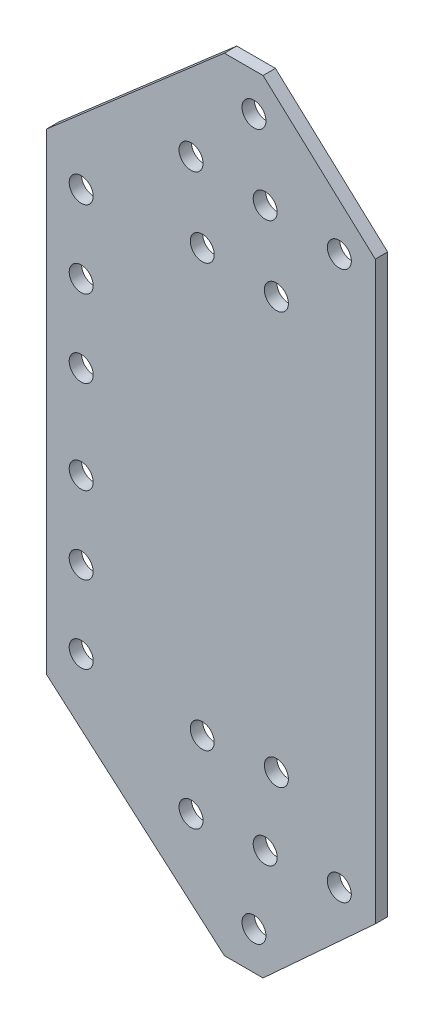
ISO-10303-21;
HEADER;
FILE_DESCRIPTION(('STEP AP214'),'2;1');
FILE_NAME('part.step','',(''),(''),'','','');
FILE_SCHEMA(('AUTOMOTIVE_DESIGN { 1 0 10303 214 1 1 1 1 }'));
ENDSEC;
DATA;
#1=APPLICATION_CONTEXT('core data for automotive mechanical design processes');
#2=APPLICATION_PROTOCOL_DEFINITION('international standard','automotive_design',2000,#1);
#3=PRODUCT_CONTEXT('',#1,'mechanical');
#4=PRODUCT('Part','Part','',(#3));
#5=PRODUCT_RELATED_PRODUCT_CATEGORY('part','',(#4));
#6=PRODUCT_DEFINITION_FORMATION('','',#4);
#7=PRODUCT_DEFINITION_CONTEXT('part definition',#1,'design');
#8=PRODUCT_DEFINITION('design','',#6,#7);
#9=PRODUCT_DEFINITION_SHAPE('','',#8);
#10=(LENGTH_UNIT() NAMED_UNIT(*) SI_UNIT(.MILLI.,.METRE.));
#11=(NAMED_UNIT(*) PLANE_ANGLE_UNIT() SI_UNIT($,.RADIAN.));
#12=(NAMED_UNIT(*) SI_UNIT($,.STERADIAN.) SOLID_ANGLE_UNIT());
#13=UNCERTAINTY_MEASURE_WITH_UNIT(LENGTH_MEASURE(1.E-05),#10,'distance_accuracy_value','');
#14=(GEOMETRIC_REPRESENTATION_CONTEXT(3) GLOBAL_UNCERTAINTY_ASSIGNED_CONTEXT((#13)) GLOBAL_UNIT_ASSIGNED_CONTEXT((#10,
#11,#12)) REPRESENTATION_CONTEXT('',''));
#15=CARTESIAN_POINT('',(0.,0.,0.));
#16=DIRECTION('',(0.,0.,1.));
#17=DIRECTION('',(1.,0.,0.));
#18=AXIS2_PLACEMENT_3D('',#15,#16,#17);
#19=CARTESIAN_POINT('',(-395.537960368614,-296.432159704098,16.));
#20=DIRECTION('',(0.656178714924787,0.754605522163505,0.));
#21=DIRECTION('',(-0.754605522163505,0.656178714924787,0.));
#22=AXIS2_PLACEMENT_3D('',#19,#20,#21);
#23=PLANE('',#22);
#24=DIRECTION('',(0.754605522163505,-0.656178714924787,0.));
#25=VECTOR('',#24,1.);
#26=CARTESIAN_POINT('',(-395.537960368614,-296.432159704098,0.));
#27=LINE('',#26,#25);
#28=CARTESIAN_POINT('',(-395.537960368614,-296.432159704098,0.));
#29=VERTEX_POINT('',#28);
#30=CARTESIAN_POINT('',(-165.537960368614,-496.432159704098,0.));
#31=VERTEX_POINT('',#30);
#32=EDGE_CURVE('E128',#29,#31,#27,.T.);
#33=ORIENTED_EDGE('',*,*,#32,.T.);
#34=DIRECTION('',(0.,0.,-1.));
#35=VECTOR('',#34,1.);
#36=CARTESIAN_POINT('',(-165.537960368614,-496.432159704098,16.));
#37=LINE('',#36,#35);
#38=CARTESIAN_POINT('',(-165.537960368614,-496.432159704098,16.));
#39=VERTEX_POINT('',#38);
#40=EDGE_CURVE('E11',#39,#31,#37,.T.);
#41=ORIENTED_EDGE('',*,*,#40,.F.);
#42=DIRECTION('',(0.754605522163505,-0.656178714924787,0.));
#43=VECTOR('',#42,1.);
#44=CARTESIAN_POINT('',(-395.537960368614,-296.432159704098,16.));
#45=LINE('',#44,#43);
#46=CARTESIAN_POINT('',(-395.537960368614,-296.432159704098,16.));
#47=VERTEX_POINT('',#46);
#48=EDGE_CURVE('E143',#47,#39,#45,.T.);
#49=ORIENTED_EDGE('',*,*,#48,.F.);
#50=DIRECTION('',(0.,0.,-1.));
#51=VECTOR('',#50,1.);
#52=CARTESIAN_POINT('',(-395.537960368614,-296.432159704098,16.));
#53=LINE('',#52,#51);
#54=EDGE_CURVE('E124',#47,#29,#53,.T.);
#55=ORIENTED_EDGE('',*,*,#54,.T.);
#56=EDGE_LOOP('',(#33,#41,#49,#55));
#57=FACE_BOUND('',#56,.T.);
#58=ADVANCED_FACE('F32',(#57),#23,.F.);
#59=CARTESIAN_POINT('',(-165.537960368614,-496.432159704098,16.));
#60=DIRECTION('',(0.,1.,0.));
#61=DIRECTION('',(0.,0.,1.));
#62=AXIS2_PLACEMENT_3D('',#59,#60,#61);
#63=PLANE('',#62);
#64=DIRECTION('',(1.,0.,0.));
#65=VECTOR('',#64,1.);
#66=CARTESIAN_POINT('',(-165.537960368614,-496.432159704098,0.));
#67=LINE('',#66,#65);
#68=CARTESIAN_POINT('',(-115.537960368614,-496.432159704098,0.));
#69=VERTEX_POINT('',#68);
#70=EDGE_CURVE('E131',#31,#69,#67,.T.);
#71=ORIENTED_EDGE('',*,*,#70,.T.);
#72=DIRECTION('',(0.,0.,-1.));
#73=VECTOR('',#72,1.);
#74=CARTESIAN_POINT('',(-115.537960368614,-496.432159704098,16.));
#75=LINE('',#74,#73);
#76=CARTESIAN_POINT('',(-115.537960368614,-496.432159704098,16.));
#77=VERTEX_POINT('',#76);
#78=EDGE_CURVE('E40',#77,#69,#75,.T.);
#79=ORIENTED_EDGE('',*,*,#78,.F.);
#80=DIRECTION('',(1.,0.,0.));
#81=VECTOR('',#80,1.);
#82=CARTESIAN_POINT('',(-165.537960368614,-496.432159704098,16.));
#83=LINE('',#82,#81);
#84=EDGE_CURVE('E91',#39,#77,#83,.T.);
#85=ORIENTED_EDGE('',*,*,#84,.F.);
#86=ORIENTED_EDGE('',*,*,#40,.T.);
#87=EDGE_LOOP('',(#71,#79,#85,#86));
#88=FACE_BOUND('',#87,.T.);
#89=ADVANCED_FACE('F346',(#88),#63,.F.);
#90=CARTESIAN_POINT('',(-115.537960368614,-496.432159704098,16.));
#91=DIRECTION('',(-0.675954740481505,0.736943138118934,0.));
#92=DIRECTION('',(-0.736943138118934,-0.675954740481505,0.));
#93=AXIS2_PLACEMENT_3D('',#90,#91,#92);
#94=PLANE('',#93);
#95=DIRECTION('',(0.736943138118933,0.675954740481505,0.));
#96=VECTOR('',#95,1.);
#97=CARTESIAN_POINT('',(-115.537960368614,-496.432159704098,0.));
#98=LINE('',#97,#96);
#99=CARTESIAN_POINT('',(29.462039631386,-363.432159704098,0.));
#100=VERTEX_POINT('',#99);
#101=EDGE_CURVE('E134',#69,#100,#98,.T.);
#102=ORIENTED_EDGE('',*,*,#101,.T.);
#103=DIRECTION('',(0.,0.,-1.));
#104=VECTOR('',#103,1.);
#105=CARTESIAN_POINT('',(29.462039631386,-363.432159704098,16.));
#106=LINE('',#105,#104);
#107=CARTESIAN_POINT('',(29.462039631386,-363.432159704098,16.));
#108=VERTEX_POINT('',#107);
#109=EDGE_CURVE('E150',#108,#100,#106,.T.);
#110=ORIENTED_EDGE('',*,*,#109,.F.);
#111=DIRECTION('',(0.736943138118933,0.675954740481505,0.));
#112=VECTOR('',#111,1.);
#113=CARTESIAN_POINT('',(-115.537960368614,-496.432159704098,16.));
#114=LINE('',#113,#112);
#115=EDGE_CURVE('E158',#77,#108,#114,.T.);
#116=ORIENTED_EDGE('',*,*,#115,.F.);
#117=ORIENTED_EDGE('',*,*,#78,.T.);
#118=EDGE_LOOP('',(#102,#110,#116,#117));
#119=FACE_BOUND('',#118,.T.);
#120=ADVANCED_FACE('F156',(#119),#94,.F.);
#121=CARTESIAN_POINT('',(29.462039631386,-363.432159704098,16.));
#122=DIRECTION('',(-1.,0.,0.));
#123=DIRECTION('',(0.,0.,1.));
#124=AXIS2_PLACEMENT_3D('',#121,#122,#123);
#125=PLANE('',#124);
#126=DIRECTION('',(0.,1.,0.));
#127=VECTOR('',#126,1.);
#128=CARTESIAN_POINT('',(29.462039631386,-363.432159704098,0.));
#129=LINE('',#128,#127);
#130=CARTESIAN_POINT('',(29.462039631386,380.567840295902,0.));
#131=VERTEX_POINT('',#130);
#132=EDGE_CURVE('E136',#100,#131,#129,.T.);
#133=ORIENTED_EDGE('',*,*,#132,.T.);
#134=DIRECTION('',(0.,0.,-1.));
#135=VECTOR('',#134,1.);
#136=CARTESIAN_POINT('',(29.462039631386,380.567840295902,16.));
#137=LINE('',#136,#135);
#138=CARTESIAN_POINT('',(29.462039631386,380.567840295902,16.));
#139=VERTEX_POINT('',#138);
#140=EDGE_CURVE('E147',#139,#131,#137,.T.);
#141=ORIENTED_EDGE('',*,*,#140,.F.);
#142=DIRECTION('',(0.,1.,0.));
#143=VECTOR('',#142,1.);
#144=CARTESIAN_POINT('',(29.462039631386,-363.432159704098,16.));
#145=LINE('',#144,#143);
#146=EDGE_CURVE('E170',#108,#139,#145,.T.);
#147=ORIENTED_EDGE('',*,*,#146,.F.);
#148=ORIENTED_EDGE('',*,*,#109,.T.);
#149=EDGE_LOOP('',(#133,#141,#147,#148));
#150=FACE_BOUND('',#149,.T.);
#151=ADVANCED_FACE('F166',(#150),#125,.F.);
#152=CARTESIAN_POINT('',(-115.537960368614,513.567840295902,16.));
#153=DIRECTION('',(-0.675954740481505,-0.736943138118934,0.));
#154=DIRECTION('',(0.736943138118934,-0.675954740481505,0.));
#155=AXIS2_PLACEMENT_3D('',#152,#153,#154);
#156=PLANE('',#155);
#157=DIRECTION('',(-0.736943138118933,0.675954740481505,0.));
#158=VECTOR('',#157,1.);
#159=CARTESIAN_POINT('',(-115.537960368614,513.567840295902,0.));
#160=LINE('',#159,#158);
#161=CARTESIAN_POINT('',(-115.537960368614,513.567840295902,0.));
#162=VERTEX_POINT('',#161);
#163=EDGE_CURVE('E138',#131,#162,#160,.T.);
#164=ORIENTED_EDGE('',*,*,#163,.T.);
#165=DIRECTION('',(0.,0.,-1.));
#166=VECTOR('',#165,1.);
#167=CARTESIAN_POINT('',(-115.537960368614,513.567840295902,16.));
#168=LINE('',#167,#166);
#169=CARTESIAN_POINT('',(-115.537960368614,513.567840295902,16.));
#170=VERTEX_POINT('',#169);
#171=EDGE_CURVE('E119',#170,#162,#168,.T.);
#172=ORIENTED_EDGE('',*,*,#171,.F.);
#173=DIRECTION('',(-0.736943138118933,0.675954740481505,0.));
#174=VECTOR('',#173,1.);
#175=CARTESIAN_POINT('',(-115.537960368614,513.567840295902,16.));
#176=LINE('',#175,#174);
#177=EDGE_CURVE('E110',#139,#170,#176,.T.);
#178=ORIENTED_EDGE('',*,*,#177,.F.);
#179=ORIENTED_EDGE('',*,*,#140,.T.);
#180=EDGE_LOOP('',(#164,#172,#178,#179));
#181=FACE_BOUND('',#180,.T.);
#182=ADVANCED_FACE('F169',(#181),#156,.F.);
#183=CARTESIAN_POINT('',(-165.537960368614,513.567840295902,16.));
#184=DIRECTION('',(0.,-1.,0.));
#185=DIRECTION('',(0.,0.,-1.));
#186=AXIS2_PLACEMENT_3D('',#183,#184,#185);
#187=PLANE('',#186);
#188=DIRECTION('',(-1.,0.,0.));
#189=VECTOR('',#188,1.);
#190=CARTESIAN_POINT('',(-165.537960368614,513.567840295902,0.));
#191=LINE('',#190,#189);
#192=CARTESIAN_POINT('',(-165.537960368614,513.567840295902,0.));
#193=VERTEX_POINT('',#192);
#194=EDGE_CURVE('E118',#162,#193,#191,.T.);
#195=ORIENTED_EDGE('',*,*,#194,.T.);
#196=DIRECTION('',(0.,0.,-1.));
#197=VECTOR('',#196,1.);
#198=CARTESIAN_POINT('',(-165.537960368614,513.567840295902,16.));
#199=LINE('',#198,#197);
#200=CARTESIAN_POINT('',(-165.537960368614,513.567840295902,16.));
#201=VERTEX_POINT('',#200);
#202=EDGE_CURVE('E115',#201,#193,#199,.T.);
#203=ORIENTED_EDGE('',*,*,#202,.F.);
#204=DIRECTION('',(-1.,0.,0.));
#205=VECTOR('',#204,1.);
#206=CARTESIAN_POINT('',(-165.537960368614,513.567840295902,16.));
#207=LINE('',#206,#205);
#208=EDGE_CURVE('E104',#170,#201,#207,.T.);
#209=ORIENTED_EDGE('',*,*,#208,.F.);
#210=ORIENTED_EDGE('',*,*,#171,.T.);
#211=EDGE_LOOP('',(#195,#203,#209,#210));
#212=FACE_BOUND('',#211,.T.);
#213=ADVANCED_FACE('F116',(#212),#187,.F.);
#214=CARTESIAN_POINT('',(-395.537960368614,313.567840295902,16.));
#215=DIRECTION('',(0.656178714924787,-0.754605522163505,0.));
#216=DIRECTION('',(0.754605522163505,0.656178714924787,0.));
#217=AXIS2_PLACEMENT_3D('',#214,#215,#216);
#218=PLANE('',#217);
#219=DIRECTION('',(-0.754605522163505,-0.656178714924787,0.));
#220=VECTOR('',#219,1.);
#221=CARTESIAN_POINT('',(-395.537960368614,313.567840295902,0.));
#222=LINE('',#221,#220);
#223=CARTESIAN_POINT('',(-395.537960368614,313.567840295902,0.));
#224=VERTEX_POINT('',#223);
#225=EDGE_CURVE('E77',#193,#224,#222,.T.);
#226=ORIENTED_EDGE('',*,*,#225,.T.);
#227=DIRECTION('',(0.,0.,-1.));
#228=VECTOR('',#227,1.);
#229=CARTESIAN_POINT('',(-395.537960368614,313.567840295902,16.));
#230=LINE('',#229,#228);
#231=CARTESIAN_POINT('',(-395.537960368614,313.567840295902,16.));
#232=VERTEX_POINT('',#231);
#233=EDGE_CURVE('E120',#232,#224,#230,.T.);
#234=ORIENTED_EDGE('',*,*,#233,.F.);
#235=DIRECTION('',(-0.754605522163505,-0.656178714924787,0.));
#236=VECTOR('',#235,1.);
#237=CARTESIAN_POINT('',(-395.537960368614,313.567840295902,16.));
#238=LINE('',#237,#236);
#239=EDGE_CURVE('E108',#201,#232,#238,.T.);
#240=ORIENTED_EDGE('',*,*,#239,.F.);
#241=ORIENTED_EDGE('',*,*,#202,.T.);
#242=EDGE_LOOP('',(#226,#234,#240,#241));
#243=FACE_BOUND('',#242,.T.);
#244=ADVANCED_FACE('F122',(#243),#218,.F.);
#245=CARTESIAN_POINT('',(-395.537960368614,313.567840295902,16.));
#246=DIRECTION('',(1.,0.,0.));
#247=DIRECTION('',(0.,0.,-1.));
#248=AXIS2_PLACEMENT_3D('',#245,#246,#247);
#249=PLANE('',#248);
#250=DIRECTION('',(0.,-1.,0.));
#251=VECTOR('',#250,1.);
#252=CARTESIAN_POINT('',(-395.537960368614,313.567840295902,0.));
#253=LINE('',#252,#251);
#254=EDGE_CURVE('E83',#224,#29,#253,.T.);
#255=ORIENTED_EDGE('',*,*,#254,.T.);
#256=ORIENTED_EDGE('',*,*,#54,.F.);
#257=DIRECTION('',(0.,-1.,0.));
#258=VECTOR('',#257,1.);
#259=CARTESIAN_POINT('',(-395.537960368614,313.567840295902,16.));
#260=LINE('',#259,#258);
#261=EDGE_CURVE('E48',#232,#47,#260,.T.);
#262=ORIENTED_EDGE('',*,*,#261,.F.);
#263=ORIENTED_EDGE('',*,*,#233,.T.);
#264=EDGE_LOOP('',(#255,#256,#262,#263));
#265=FACE_BOUND('',#264,.T.);
#266=ADVANCED_FACE('F295',(#265),#249,.F.);
#267=CARTESIAN_POINT('',(-139.870902137367,-518.751340774747,16.));
#268=DIRECTION('',(0.,0.,1.));
#269=DIRECTION('',(1.,0.,0.));
#270=AXIS2_PLACEMENT_3D('',#267,#268,#269);
#271=PLANE('',#270);
#272=CARTESIAN_POINT('',(-350.537960368614,68.5678402959024,16.));
#273=DIRECTION('',(0.,0.,1.));
#274=DIRECTION('',(-1.,0.,0.));
#275=AXIS2_PLACEMENT_3D('',#272,#273,#274);
#276=CIRCLE('',#275,15.5);
#277=CARTESIAN_POINT('',(-366.037960368614,68.5678402959024,16.));
#278=VERTEX_POINT('',#277);
#279=EDGE_CURVE('E278',#278,#278,#276,.T.);
#280=ORIENTED_EDGE('',*,*,#279,.F.);
#281=EDGE_LOOP('',(#280));
#282=FACE_BOUND('',#281,.T.);
#283=CARTESIAN_POINT('',(-350.537960368614,268.567840295902,16.));
#284=DIRECTION('',(0.,0.,1.));
#285=DIRECTION('',(-1.,0.,0.));
#286=AXIS2_PLACEMENT_3D('',#283,#284,#285);
#287=CIRCLE('',#286,15.5);
#288=CARTESIAN_POINT('',(-366.037960368614,268.567840295902,16.));
#289=VERTEX_POINT('',#288);
#290=EDGE_CURVE('E272',#289,#289,#287,.T.);
#291=ORIENTED_EDGE('',*,*,#290,.F.);
#292=EDGE_LOOP('',(#291));
#293=FACE_BOUND('',#292,.T.);
#294=CARTESIAN_POINT('',(-350.537960368614,168.567840295902,16.));
#295=DIRECTION('',(0.,0.,1.));
#296=DIRECTION('',(-1.,0.,0.));
#297=AXIS2_PLACEMENT_3D('',#294,#295,#296);
#298=CIRCLE('',#297,15.5);
#299=CARTESIAN_POINT('',(-366.037960368614,168.567840295902,16.));
#300=VERTEX_POINT('',#299);
#301=EDGE_CURVE('E266',#300,#300,#298,.T.);
#302=ORIENTED_EDGE('',*,*,#301,.F.);
#303=EDGE_LOOP('',(#302));
#304=FACE_BOUND('',#303,.T.);
#305=CARTESIAN_POINT('',(-194.104974178792,281.372630311893,16.));
#306=DIRECTION('',(0.,0.,1.));
#307=DIRECTION('',(-1.,0.,0.));
#308=AXIS2_PLACEMENT_3D('',#305,#306,#307);
#309=CIRCLE('',#308,15.5);
#310=CARTESIAN_POINT('',(-209.604974178792,281.372630311893,16.));
#311=VERTEX_POINT('',#310);
#312=EDGE_CURVE('E260',#311,#311,#309,.T.);
#313=ORIENTED_EDGE('',*,*,#312,.F.);
#314=EDGE_LOOP('',(#313));
#315=FACE_BOUND('',#314,.T.);
#316=CARTESIAN_POINT('',(-112.778940909856,369.611376408699,16.));
#317=DIRECTION('',(0.,0.,1.));
#318=DIRECTION('',(-1.,0.,0.));
#319=AXIS2_PLACEMENT_3D('',#316,#317,#318);
#320=CIRCLE('',#319,15.5);
#321=CARTESIAN_POINT('',(-128.278940909856,369.611376408699,16.));
#322=VERTEX_POINT('',#321);
#323=EDGE_CURVE('E254',#322,#322,#320,.T.);
#324=ORIENTED_EDGE('',*,*,#323,.F.);
#325=EDGE_LOOP('',(#324));
#326=FACE_BOUND('',#325,.T.);
#327=CARTESIAN_POINT('',(-98.2927412338135,274.663232567205,16.));
#328=DIRECTION('',(0.,0.,1.));
#329=DIRECTION('',(-1.,0.,0.));
#330=AXIS2_PLACEMENT_3D('',#327,#328,#329);
#331=CIRCLE('',#330,15.5);
#332=CARTESIAN_POINT('',(-113.792741233814,274.663232567205,16.));
#333=VERTEX_POINT('',#332);
#334=EDGE_CURVE('E248',#333,#333,#331,.T.);
#335=ORIENTED_EDGE('',*,*,#334,.F.);
#336=EDGE_LOOP('',(#335));
#337=FACE_BOUND('',#336,.T.);
#338=CARTESIAN_POINT('',(-208.591173854834,376.320774153387,16.));
#339=DIRECTION('',(0.,0.,1.));
#340=DIRECTION('',(1.,0.,0.));
#341=AXIS2_PLACEMENT_3D('',#338,#339,#340);
#342=CIRCLE('',#341,15.5);
#343=CARTESIAN_POINT('',(-193.091173854834,376.320774153387,16.));
#344=VERTEX_POINT('',#343);
#345=EDGE_CURVE('E242',#344,#344,#342,.T.);
#346=ORIENTED_EDGE('',*,*,#345,.F.);
#347=EDGE_LOOP('',(#346));
#348=FACE_BOUND('',#347,.T.);
#349=CARTESIAN_POINT('',(-127.265140585898,464.559520250192,16.));
#350=DIRECTION('',(0.,0.,1.));
#351=DIRECTION('',(-1.,0.,0.));
#352=AXIS2_PLACEMENT_3D('',#349,#350,#351);
#353=CIRCLE('',#352,15.5);
#354=CARTESIAN_POINT('',(-142.765140585898,464.559520250192,16.));
#355=VERTEX_POINT('',#354);
#356=EDGE_CURVE('E236',#355,#355,#353,.T.);
#357=ORIENTED_EDGE('',*,*,#356,.F.);
#358=EDGE_LOOP('',(#357));
#359=FACE_BOUND('',#358,.T.);
#360=CARTESIAN_POINT('',(-16.966707964878,362.901978664011,16.));
#361=DIRECTION('',(0.,0.,1.));
#362=DIRECTION('',(1.,0.,0.));
#363=AXIS2_PLACEMENT_3D('',#360,#361,#362);
#364=CIRCLE('',#363,15.5);
#365=CARTESIAN_POINT('',(-1.46670796487796,362.901978664011,16.));
#366=VERTEX_POINT('',#365);
#367=EDGE_CURVE('E230',#366,#366,#364,.T.);
#368=ORIENTED_EDGE('',*,*,#367,.F.);
#369=EDGE_LOOP('',(#368));
#370=FACE_BOUND('',#369,.T.);
#371=CARTESIAN_POINT('',(-16.966707964878,-345.766298072206,16.));
#372=DIRECTION('',(0.,0.,1.));
#373=DIRECTION('',(-1.,0.,0.));
#374=AXIS2_PLACEMENT_3D('',#371,#372,#373);
#375=CIRCLE('',#374,15.5);
#376=CARTESIAN_POINT('',(-32.466707964878,-345.766298072206,16.));
#377=VERTEX_POINT('',#376);
#378=EDGE_CURVE('E224',#377,#377,#375,.T.);
#379=ORIENTED_EDGE('',*,*,#378,.F.);
#380=EDGE_LOOP('',(#379));
#381=FACE_BOUND('',#380,.T.);
#382=CARTESIAN_POINT('',(-127.265140585898,-447.423839658387,16.));
#383=DIRECTION('',(0.,0.,1.));
#384=DIRECTION('',(1.,0.,0.));
#385=AXIS2_PLACEMENT_3D('',#382,#383,#384);
#386=CIRCLE('',#385,15.5);
#387=CARTESIAN_POINT('',(-111.765140585898,-447.423839658387,16.));
#388=VERTEX_POINT('',#387);
#389=EDGE_CURVE('E218',#388,#388,#386,.T.);
#390=ORIENTED_EDGE('',*,*,#389,.F.);
#391=EDGE_LOOP('',(#390));
#392=FACE_BOUND('',#391,.T.);
#393=CARTESIAN_POINT('',(-208.591173854834,-359.185093561582,16.));
#394=DIRECTION('',(0.,0.,1.));
#395=DIRECTION('',(-1.,0.,0.));
#396=AXIS2_PLACEMENT_3D('',#393,#394,#395);
#397=CIRCLE('',#396,15.5);
#398=CARTESIAN_POINT('',(-224.091173854834,-359.185093561582,16.));
#399=VERTEX_POINT('',#398);
#400=EDGE_CURVE('E212',#399,#399,#397,.T.);
#401=ORIENTED_EDGE('',*,*,#400,.F.);
#402=EDGE_LOOP('',(#401));
#403=FACE_BOUND('',#402,.T.);
#404=CARTESIAN_POINT('',(-98.2927412338135,-257.5275519754,16.));
#405=DIRECTION('',(0.,0.,1.));
#406=DIRECTION('',(1.,0.,0.));
#407=AXIS2_PLACEMENT_3D('',#404,#405,#406);
#408=CIRCLE('',#407,15.5000000000001);
#409=CARTESIAN_POINT('',(-82.7927412338134,-257.5275519754,16.));
#410=VERTEX_POINT('',#409);
#411=EDGE_CURVE('E206',#410,#410,#408,.T.);
#412=ORIENTED_EDGE('',*,*,#411,.F.);
#413=EDGE_LOOP('',(#412));
#414=FACE_BOUND('',#413,.T.);
#415=CARTESIAN_POINT('',(-112.778940909856,-352.475695816894,16.));
#416=DIRECTION('',(0.,0.,1.));
#417=DIRECTION('',(1.,0.,0.));
#418=AXIS2_PLACEMENT_3D('',#415,#416,#417);
#419=CIRCLE('',#418,15.5);
#420=CARTESIAN_POINT('',(-97.2789409098559,-352.475695816894,16.));
#421=VERTEX_POINT('',#420);
#422=EDGE_CURVE('E200',#421,#421,#419,.T.);
#423=ORIENTED_EDGE('',*,*,#422,.F.);
#424=EDGE_LOOP('',(#423));
#425=FACE_BOUND('',#424,.T.);
#426=CARTESIAN_POINT('',(-194.104974178792,-264.236949720088,16.));
#427=DIRECTION('',(0.,0.,1.));
#428=DIRECTION('',(1.,0.,0.));
#429=AXIS2_PLACEMENT_3D('',#426,#427,#428);
#430=CIRCLE('',#429,15.5);
#431=CARTESIAN_POINT('',(-178.604974178792,-264.236949720088,16.));
#432=VERTEX_POINT('',#431);
#433=EDGE_CURVE('E194',#432,#432,#430,.T.);
#434=ORIENTED_EDGE('',*,*,#433,.F.);
#435=EDGE_LOOP('',(#434));
#436=FACE_BOUND('',#435,.T.);
#437=CARTESIAN_POINT('',(-350.537960368614,-151.432159704098,16.));
#438=DIRECTION('',(0.,0.,1.));
#439=DIRECTION('',(1.,0.,0.));
#440=AXIS2_PLACEMENT_3D('',#437,#438,#439);
#441=CIRCLE('',#440,15.5);
#442=CARTESIAN_POINT('',(-335.037960368614,-151.432159704098,16.));
#443=VERTEX_POINT('',#442);
#444=EDGE_CURVE('E188',#443,#443,#441,.T.);
#445=ORIENTED_EDGE('',*,*,#444,.F.);
#446=EDGE_LOOP('',(#445));
#447=FACE_BOUND('',#446,.T.);
#448=CARTESIAN_POINT('',(-350.537960368614,-251.432159704098,16.));
#449=DIRECTION('',(0.,0.,1.));
#450=DIRECTION('',(1.,0.,0.));
#451=AXIS2_PLACEMENT_3D('',#448,#449,#450);
#452=CIRCLE('',#451,15.5);
#453=CARTESIAN_POINT('',(-335.037960368614,-251.432159704098,16.));
#454=VERTEX_POINT('',#453);
#455=EDGE_CURVE('E182',#454,#454,#452,.T.);
#456=ORIENTED_EDGE('',*,*,#455,.F.);
#457=EDGE_LOOP('',(#456));
#458=FACE_BOUND('',#457,.T.);
#459=CARTESIAN_POINT('',(-350.537960368614,-51.4321597040976,16.));
#460=DIRECTION('',(0.,0.,1.));
#461=DIRECTION('',(1.,0.,0.));
#462=AXIS2_PLACEMENT_3D('',#459,#460,#461);
#463=CIRCLE('',#462,15.5);
#464=CARTESIAN_POINT('',(-335.037960368614,-51.4321597040976,16.));
#465=VERTEX_POINT('',#464);
#466=EDGE_CURVE('E176',#465,#465,#463,.T.);
#467=ORIENTED_EDGE('',*,*,#466,.F.);
#468=EDGE_LOOP('',(#467));
#469=FACE_BOUND('',#468,.T.);
#470=ORIENTED_EDGE('',*,*,#48,.T.);
#471=ORIENTED_EDGE('',*,*,#84,.T.);
#472=ORIENTED_EDGE('',*,*,#115,.T.);
#473=ORIENTED_EDGE('',*,*,#146,.T.);
#474=ORIENTED_EDGE('',*,*,#177,.T.);
#475=ORIENTED_EDGE('',*,*,#208,.T.);
#476=ORIENTED_EDGE('',*,*,#239,.T.);
#477=ORIENTED_EDGE('',*,*,#261,.T.);
#478=EDGE_LOOP('',(#470,#471,#472,#473,#474,#475,#476,#477));
#479=FACE_BOUND('',#478,.T.);
#480=ADVANCED_FACE('F106',(#282,#293,#304,#315,#326,#337,#348,#359,#370,#381,#392,#403,#414,
#425,#436,#447,#458,#469,#479),#271,.T.);
#481=CARTESIAN_POINT('',(-139.870902137367,-518.751340774747,0.));
#482=DIRECTION('',(0.,0.,1.));
#483=DIRECTION('',(1.,0.,0.));
#484=AXIS2_PLACEMENT_3D('',#481,#482,#483);
#485=PLANE('',#484);
#486=CARTESIAN_POINT('',(-350.537960368614,68.5678402959024,0.));
#487=DIRECTION('',(0.,0.,1.));
#488=DIRECTION('',(-1.,0.,0.));
#489=AXIS2_PLACEMENT_3D('',#486,#487,#488);
#490=CIRCLE('',#489,15.5);
#491=CARTESIAN_POINT('',(-366.037960368614,68.5678402959024,0.));
#492=VERTEX_POINT('',#491);
#493=EDGE_CURVE('E275',#492,#492,#490,.T.);
#494=ORIENTED_EDGE('',*,*,#493,.T.);
#495=EDGE_LOOP('',(#494));
#496=FACE_BOUND('',#495,.T.);
#497=CARTESIAN_POINT('',(-350.537960368614,268.567840295902,0.));
#498=DIRECTION('',(0.,0.,1.));
#499=DIRECTION('',(-1.,0.,0.));
#500=AXIS2_PLACEMENT_3D('',#497,#498,#499);
#501=CIRCLE('',#500,15.5);
#502=CARTESIAN_POINT('',(-366.037960368614,268.567840295902,0.));
#503=VERTEX_POINT('',#502);
#504=EDGE_CURVE('E269',#503,#503,#501,.T.);
#505=ORIENTED_EDGE('',*,*,#504,.T.);
#506=EDGE_LOOP('',(#505));
#507=FACE_BOUND('',#506,.T.);
#508=CARTESIAN_POINT('',(-350.537960368614,168.567840295902,0.));
#509=DIRECTION('',(0.,0.,1.));
#510=DIRECTION('',(-1.,0.,0.));
#511=AXIS2_PLACEMENT_3D('',#508,#509,#510);
#512=CIRCLE('',#511,15.5);
#513=CARTESIAN_POINT('',(-366.037960368614,168.567840295902,0.));
#514=VERTEX_POINT('',#513);
#515=EDGE_CURVE('E263',#514,#514,#512,.T.);
#516=ORIENTED_EDGE('',*,*,#515,.T.);
#517=EDGE_LOOP('',(#516));
#518=FACE_BOUND('',#517,.T.);
#519=CARTESIAN_POINT('',(-194.104974178792,281.372630311893,0.));
#520=DIRECTION('',(0.,0.,1.));
#521=DIRECTION('',(-1.,0.,0.));
#522=AXIS2_PLACEMENT_3D('',#519,#520,#521);
#523=CIRCLE('',#522,15.5);
#524=CARTESIAN_POINT('',(-209.604974178792,281.372630311893,0.));
#525=VERTEX_POINT('',#524);
#526=EDGE_CURVE('E257',#525,#525,#523,.T.);
#527=ORIENTED_EDGE('',*,*,#526,.T.);
#528=EDGE_LOOP('',(#527));
#529=FACE_BOUND('',#528,.T.);
#530=CARTESIAN_POINT('',(-112.778940909856,369.611376408699,0.));
#531=DIRECTION('',(0.,0.,1.));
#532=DIRECTION('',(-1.,0.,0.));
#533=AXIS2_PLACEMENT_3D('',#530,#531,#532);
#534=CIRCLE('',#533,15.5);
#535=CARTESIAN_POINT('',(-128.278940909856,369.611376408699,0.));
#536=VERTEX_POINT('',#535);
#537=EDGE_CURVE('E251',#536,#536,#534,.T.);
#538=ORIENTED_EDGE('',*,*,#537,.T.);
#539=EDGE_LOOP('',(#538));
#540=FACE_BOUND('',#539,.T.);
#541=CARTESIAN_POINT('',(-98.2927412338135,274.663232567205,0.));
#542=DIRECTION('',(0.,0.,1.));
#543=DIRECTION('',(-1.,0.,0.));
#544=AXIS2_PLACEMENT_3D('',#541,#542,#543);
#545=CIRCLE('',#544,15.5);
#546=CARTESIAN_POINT('',(-113.792741233814,274.663232567205,0.));
#547=VERTEX_POINT('',#546);
#548=EDGE_CURVE('E245',#547,#547,#545,.T.);
#549=ORIENTED_EDGE('',*,*,#548,.T.);
#550=EDGE_LOOP('',(#549));
#551=FACE_BOUND('',#550,.T.);
#552=CARTESIAN_POINT('',(-208.591173854834,376.320774153387,0.));
#553=DIRECTION('',(0.,0.,1.));
#554=DIRECTION('',(1.,0.,0.));
#555=AXIS2_PLACEMENT_3D('',#552,#553,#554);
#556=CIRCLE('',#555,15.5);
#557=CARTESIAN_POINT('',(-193.091173854834,376.320774153387,0.));
#558=VERTEX_POINT('',#557);
#559=EDGE_CURVE('E239',#558,#558,#556,.T.);
#560=ORIENTED_EDGE('',*,*,#559,.T.);
#561=EDGE_LOOP('',(#560));
#562=FACE_BOUND('',#561,.T.);
#563=CARTESIAN_POINT('',(-127.265140585898,464.559520250192,0.));
#564=DIRECTION('',(0.,0.,1.));
#565=DIRECTION('',(-1.,0.,0.));
#566=AXIS2_PLACEMENT_3D('',#563,#564,#565);
#567=CIRCLE('',#566,15.5);
#568=CARTESIAN_POINT('',(-142.765140585898,464.559520250192,0.));
#569=VERTEX_POINT('',#568);
#570=EDGE_CURVE('E233',#569,#569,#567,.T.);
#571=ORIENTED_EDGE('',*,*,#570,.T.);
#572=EDGE_LOOP('',(#571));
#573=FACE_BOUND('',#572,.T.);
#574=CARTESIAN_POINT('',(-16.966707964878,362.901978664011,0.));
#575=DIRECTION('',(0.,0.,1.));
#576=DIRECTION('',(1.,0.,0.));
#577=AXIS2_PLACEMENT_3D('',#574,#575,#576);
#578=CIRCLE('',#577,15.5);
#579=CARTESIAN_POINT('',(-1.46670796487796,362.901978664011,0.));
#580=VERTEX_POINT('',#579);
#581=EDGE_CURVE('E227',#580,#580,#578,.T.);
#582=ORIENTED_EDGE('',*,*,#581,.T.);
#583=EDGE_LOOP('',(#582));
#584=FACE_BOUND('',#583,.T.);
#585=CARTESIAN_POINT('',(-16.966707964878,-345.766298072206,0.));
#586=DIRECTION('',(0.,0.,1.));
#587=DIRECTION('',(-1.,0.,0.));
#588=AXIS2_PLACEMENT_3D('',#585,#586,#587);
#589=CIRCLE('',#588,15.5);
#590=CARTESIAN_POINT('',(-32.466707964878,-345.766298072206,0.));
#591=VERTEX_POINT('',#590);
#592=EDGE_CURVE('E221',#591,#591,#589,.T.);
#593=ORIENTED_EDGE('',*,*,#592,.T.);
#594=EDGE_LOOP('',(#593));
#595=FACE_BOUND('',#594,.T.);
#596=CARTESIAN_POINT('',(-127.265140585898,-447.423839658387,0.));
#597=DIRECTION('',(0.,0.,1.));
#598=DIRECTION('',(1.,0.,0.));
#599=AXIS2_PLACEMENT_3D('',#596,#597,#598);
#600=CIRCLE('',#599,15.5);
#601=CARTESIAN_POINT('',(-111.765140585898,-447.423839658387,0.));
#602=VERTEX_POINT('',#601);
#603=EDGE_CURVE('E215',#602,#602,#600,.T.);
#604=ORIENTED_EDGE('',*,*,#603,.T.);
#605=EDGE_LOOP('',(#604));
#606=FACE_BOUND('',#605,.T.);
#607=CARTESIAN_POINT('',(-208.591173854834,-359.185093561582,0.));
#608=DIRECTION('',(0.,0.,1.));
#609=DIRECTION('',(-1.,0.,0.));
#610=AXIS2_PLACEMENT_3D('',#607,#608,#609);
#611=CIRCLE('',#610,15.5);
#612=CARTESIAN_POINT('',(-224.091173854834,-359.185093561582,0.));
#613=VERTEX_POINT('',#612);
#614=EDGE_CURVE('E209',#613,#613,#611,.T.);
#615=ORIENTED_EDGE('',*,*,#614,.T.);
#616=EDGE_LOOP('',(#615));
#617=FACE_BOUND('',#616,.T.);
#618=CARTESIAN_POINT('',(-98.2927412338135,-257.5275519754,0.));
#619=DIRECTION('',(0.,0.,1.));
#620=DIRECTION('',(1.,0.,0.));
#621=AXIS2_PLACEMENT_3D('',#618,#619,#620);
#622=CIRCLE('',#621,15.5000000000001);
#623=CARTESIAN_POINT('',(-82.7927412338134,-257.5275519754,0.));
#624=VERTEX_POINT('',#623);
#625=EDGE_CURVE('E203',#624,#624,#622,.T.);
#626=ORIENTED_EDGE('',*,*,#625,.T.);
#627=EDGE_LOOP('',(#626));
#628=FACE_BOUND('',#627,.T.);
#629=CARTESIAN_POINT('',(-112.778940909856,-352.475695816894,0.));
#630=DIRECTION('',(0.,0.,1.));
#631=DIRECTION('',(1.,0.,0.));
#632=AXIS2_PLACEMENT_3D('',#629,#630,#631);
#633=CIRCLE('',#632,15.5);
#634=CARTESIAN_POINT('',(-97.2789409098559,-352.475695816894,0.));
#635=VERTEX_POINT('',#634);
#636=EDGE_CURVE('E197',#635,#635,#633,.T.);
#637=ORIENTED_EDGE('',*,*,#636,.T.);
#638=EDGE_LOOP('',(#637));
#639=FACE_BOUND('',#638,.T.);
#640=CARTESIAN_POINT('',(-194.104974178792,-264.236949720088,0.));
#641=DIRECTION('',(0.,0.,1.));
#642=DIRECTION('',(1.,0.,0.));
#643=AXIS2_PLACEMENT_3D('',#640,#641,#642);
#644=CIRCLE('',#643,15.5);
#645=CARTESIAN_POINT('',(-178.604974178792,-264.236949720088,0.));
#646=VERTEX_POINT('',#645);
#647=EDGE_CURVE('E191',#646,#646,#644,.T.);
#648=ORIENTED_EDGE('',*,*,#647,.T.);
#649=EDGE_LOOP('',(#648));
#650=FACE_BOUND('',#649,.T.);
#651=CARTESIAN_POINT('',(-350.537960368614,-151.432159704098,0.));
#652=DIRECTION('',(0.,0.,1.));
#653=DIRECTION('',(1.,0.,0.));
#654=AXIS2_PLACEMENT_3D('',#651,#652,#653);
#655=CIRCLE('',#654,15.5);
#656=CARTESIAN_POINT('',(-335.037960368614,-151.432159704098,0.));
#657=VERTEX_POINT('',#656);
#658=EDGE_CURVE('E185',#657,#657,#655,.T.);
#659=ORIENTED_EDGE('',*,*,#658,.T.);
#660=EDGE_LOOP('',(#659));
#661=FACE_BOUND('',#660,.T.);
#662=CARTESIAN_POINT('',(-350.537960368614,-251.432159704098,0.));
#663=DIRECTION('',(0.,0.,1.));
#664=DIRECTION('',(1.,0.,0.));
#665=AXIS2_PLACEMENT_3D('',#662,#663,#664);
#666=CIRCLE('',#665,15.5);
#667=CARTESIAN_POINT('',(-335.037960368614,-251.432159704098,0.));
#668=VERTEX_POINT('',#667);
#669=EDGE_CURVE('E179',#668,#668,#666,.T.);
#670=ORIENTED_EDGE('',*,*,#669,.T.);
#671=EDGE_LOOP('',(#670));
#672=FACE_BOUND('',#671,.T.);
#673=CARTESIAN_POINT('',(-350.537960368614,-51.4321597040976,0.));
#674=DIRECTION('',(0.,0.,1.));
#675=DIRECTION('',(1.,0.,0.));
#676=AXIS2_PLACEMENT_3D('',#673,#674,#675);
#677=CIRCLE('',#676,15.5);
#678=CARTESIAN_POINT('',(-335.037960368614,-51.4321597040976,0.));
#679=VERTEX_POINT('',#678);
#680=EDGE_CURVE('E132',#679,#679,#677,.T.);
#681=ORIENTED_EDGE('',*,*,#680,.T.);
#682=EDGE_LOOP('',(#681));
#683=FACE_BOUND('',#682,.T.);
#684=ORIENTED_EDGE('',*,*,#32,.F.);
#685=ORIENTED_EDGE('',*,*,#254,.F.);
#686=ORIENTED_EDGE('',*,*,#225,.F.);
#687=ORIENTED_EDGE('',*,*,#194,.F.);
#688=ORIENTED_EDGE('',*,*,#163,.F.);
#689=ORIENTED_EDGE('',*,*,#132,.F.);
#690=ORIENTED_EDGE('',*,*,#101,.F.);
#691=ORIENTED_EDGE('',*,*,#70,.F.);
#692=EDGE_LOOP('',(#684,#685,#686,#687,#688,#689,#690,#691));
#693=FACE_BOUND('',#692,.T.);
#694=ADVANCED_FACE('F162',(#496,#507,#518,#529,#540,#551,#562,#573,#584,#595,#606,#617,#628,
#639,#650,#661,#672,#683,#693),#485,.F.);
#695=CARTESIAN_POINT('',(-350.537960368614,-51.4321597040976,0.));
#696=DIRECTION('',(0.,0.,1.));
#697=DIRECTION('',(1.,0.,0.));
#698=AXIS2_PLACEMENT_3D('',#695,#696,#697);
#699=CYLINDRICAL_SURFACE('',#698,15.5);
#700=ORIENTED_EDGE('',*,*,#680,.F.);
#701=EDGE_LOOP('',(#700));
#702=FACE_BOUND('',#701,.T.);
#703=ORIENTED_EDGE('',*,*,#466,.T.);
#704=EDGE_LOOP('',(#703));
#705=FACE_BOUND('',#704,.T.);
#706=ADVANCED_FACE('F331',(#702,#705),#699,.F.);
#707=CARTESIAN_POINT('',(-350.537960368614,-251.432159704098,0.));
#708=DIRECTION('',(0.,0.,1.));
#709=DIRECTION('',(1.,0.,0.));
#710=AXIS2_PLACEMENT_3D('',#707,#708,#709);
#711=CYLINDRICAL_SURFACE('',#710,15.5);
#712=ORIENTED_EDGE('',*,*,#669,.F.);
#713=EDGE_LOOP('',(#712));
#714=FACE_BOUND('',#713,.T.);
#715=ORIENTED_EDGE('',*,*,#455,.T.);
#716=EDGE_LOOP('',(#715));
#717=FACE_BOUND('',#716,.T.);
#718=ADVANCED_FACE('F333',(#714,#717),#711,.F.);
#719=CARTESIAN_POINT('',(-350.537960368614,-151.432159704098,0.));
#720=DIRECTION('',(0.,0.,1.));
#721=DIRECTION('',(1.,0.,0.));
#722=AXIS2_PLACEMENT_3D('',#719,#720,#721);
#723=CYLINDRICAL_SURFACE('',#722,15.5);
#724=ORIENTED_EDGE('',*,*,#658,.F.);
#725=EDGE_LOOP('',(#724));
#726=FACE_BOUND('',#725,.T.);
#727=ORIENTED_EDGE('',*,*,#444,.T.);
#728=EDGE_LOOP('',(#727));
#729=FACE_BOUND('',#728,.T.);
#730=ADVANCED_FACE('F340',(#726,#729),#723,.F.);
#731=CARTESIAN_POINT('',(-194.104974178792,-264.236949720088,0.));
#732=DIRECTION('',(0.,0.,1.));
#733=DIRECTION('',(1.,0.,0.));
#734=AXIS2_PLACEMENT_3D('',#731,#732,#733);
#735=CYLINDRICAL_SURFACE('',#734,15.5);
#736=ORIENTED_EDGE('',*,*,#647,.F.);
#737=EDGE_LOOP('',(#736));
#738=FACE_BOUND('',#737,.T.);
#739=ORIENTED_EDGE('',*,*,#433,.T.);
#740=EDGE_LOOP('',(#739));
#741=FACE_BOUND('',#740,.T.);
#742=ADVANCED_FACE('F422',(#738,#741),#735,.F.);
#743=CARTESIAN_POINT('',(-112.778940909856,-352.475695816894,0.));
#744=DIRECTION('',(0.,0.,1.));
#745=DIRECTION('',(1.,0.,0.));
#746=AXIS2_PLACEMENT_3D('',#743,#744,#745);
#747=CYLINDRICAL_SURFACE('',#746,15.5);
#748=ORIENTED_EDGE('',*,*,#636,.F.);
#749=EDGE_LOOP('',(#748));
#750=FACE_BOUND('',#749,.T.);
#751=ORIENTED_EDGE('',*,*,#422,.T.);
#752=EDGE_LOOP('',(#751));
#753=FACE_BOUND('',#752,.T.);
#754=ADVANCED_FACE('F432',(#750,#753),#747,.F.);
#755=CARTESIAN_POINT('',(-98.2927412338135,-257.5275519754,0.));
#756=DIRECTION('',(0.,0.,1.));
#757=DIRECTION('',(1.,0.,0.));
#758=AXIS2_PLACEMENT_3D('',#755,#756,#757);
#759=CYLINDRICAL_SURFACE('',#758,15.5000000000001);
#760=ORIENTED_EDGE('',*,*,#625,.F.);
#761=EDGE_LOOP('',(#760));
#762=FACE_BOUND('',#761,.T.);
#763=ORIENTED_EDGE('',*,*,#411,.T.);
#764=EDGE_LOOP('',(#763));
#765=FACE_BOUND('',#764,.T.);
#766=ADVANCED_FACE('F442',(#762,#765),#759,.F.);
#767=CARTESIAN_POINT('',(-208.591173854834,-359.185093561582,0.));
#768=DIRECTION('',(0.,0.,1.));
#769=DIRECTION('',(1.,0.,0.));
#770=AXIS2_PLACEMENT_3D('',#767,#768,#769);
#771=CYLINDRICAL_SURFACE('',#770,15.5);
#772=ORIENTED_EDGE('',*,*,#614,.F.);
#773=EDGE_LOOP('',(#772));
#774=FACE_BOUND('',#773,.T.);
#775=ORIENTED_EDGE('',*,*,#400,.T.);
#776=EDGE_LOOP('',(#775));
#777=FACE_BOUND('',#776,.T.);
#778=ADVANCED_FACE('F452',(#774,#777),#771,.F.);
#779=CARTESIAN_POINT('',(-127.265140585898,-447.423839658387,0.));
#780=DIRECTION('',(0.,0.,1.));
#781=DIRECTION('',(1.,0.,0.));
#782=AXIS2_PLACEMENT_3D('',#779,#780,#781);
#783=CYLINDRICAL_SURFACE('',#782,15.5);
#784=ORIENTED_EDGE('',*,*,#603,.F.);
#785=EDGE_LOOP('',(#784));
#786=FACE_BOUND('',#785,.T.);
#787=ORIENTED_EDGE('',*,*,#389,.T.);
#788=EDGE_LOOP('',(#787));
#789=FACE_BOUND('',#788,.T.);
#790=ADVANCED_FACE('F462',(#786,#789),#783,.F.);
#791=CARTESIAN_POINT('',(-16.966707964878,-345.766298072206,0.));
#792=DIRECTION('',(0.,0.,1.));
#793=DIRECTION('',(1.,0.,0.));
#794=AXIS2_PLACEMENT_3D('',#791,#792,#793);
#795=CYLINDRICAL_SURFACE('',#794,15.5);
#796=ORIENTED_EDGE('',*,*,#592,.F.);
#797=EDGE_LOOP('',(#796));
#798=FACE_BOUND('',#797,.T.);
#799=ORIENTED_EDGE('',*,*,#378,.T.);
#800=EDGE_LOOP('',(#799));
#801=FACE_BOUND('',#800,.T.);
#802=ADVANCED_FACE('F472',(#798,#801),#795,.F.);
#803=CARTESIAN_POINT('',(-16.966707964878,362.901978664011,0.));
#804=DIRECTION('',(0.,0.,1.));
#805=DIRECTION('',(1.,0.,0.));
#806=AXIS2_PLACEMENT_3D('',#803,#804,#805);
#807=CYLINDRICAL_SURFACE('',#806,15.5);
#808=ORIENTED_EDGE('',*,*,#581,.F.);
#809=EDGE_LOOP('',(#808));
#810=FACE_BOUND('',#809,.T.);
#811=ORIENTED_EDGE('',*,*,#367,.T.);
#812=EDGE_LOOP('',(#811));
#813=FACE_BOUND('',#812,.T.);
#814=ADVANCED_FACE('F482',(#810,#813),#807,.F.);
#815=CARTESIAN_POINT('',(-127.265140585898,464.559520250192,0.));
#816=DIRECTION('',(0.,0.,1.));
#817=DIRECTION('',(1.,0.,0.));
#818=AXIS2_PLACEMENT_3D('',#815,#816,#817);
#819=CYLINDRICAL_SURFACE('',#818,15.5);
#820=ORIENTED_EDGE('',*,*,#570,.F.);
#821=EDGE_LOOP('',(#820));
#822=FACE_BOUND('',#821,.T.);
#823=ORIENTED_EDGE('',*,*,#356,.T.);
#824=EDGE_LOOP('',(#823));
#825=FACE_BOUND('',#824,.T.);
#826=ADVANCED_FACE('F492',(#822,#825),#819,.F.);
#827=CARTESIAN_POINT('',(-208.591173854834,376.320774153387,0.));
#828=DIRECTION('',(0.,0.,1.));
#829=DIRECTION('',(1.,0.,0.));
#830=AXIS2_PLACEMENT_3D('',#827,#828,#829);
#831=CYLINDRICAL_SURFACE('',#830,15.5);
#832=ORIENTED_EDGE('',*,*,#559,.F.);
#833=EDGE_LOOP('',(#832));
#834=FACE_BOUND('',#833,.T.);
#835=ORIENTED_EDGE('',*,*,#345,.T.);
#836=EDGE_LOOP('',(#835));
#837=FACE_BOUND('',#836,.T.);
#838=ADVANCED_FACE('F502',(#834,#837),#831,.F.);
#839=CARTESIAN_POINT('',(-98.2927412338135,274.663232567205,0.));
#840=DIRECTION('',(0.,0.,1.));
#841=DIRECTION('',(1.,0.,0.));
#842=AXIS2_PLACEMENT_3D('',#839,#840,#841);
#843=CYLINDRICAL_SURFACE('',#842,15.5);
#844=ORIENTED_EDGE('',*,*,#548,.F.);
#845=EDGE_LOOP('',(#844));
#846=FACE_BOUND('',#845,.T.);
#847=ORIENTED_EDGE('',*,*,#334,.T.);
#848=EDGE_LOOP('',(#847));
#849=FACE_BOUND('',#848,.T.);
#850=ADVANCED_FACE('F512',(#846,#849),#843,.F.);
#851=CARTESIAN_POINT('',(-112.778940909856,369.611376408699,0.));
#852=DIRECTION('',(0.,0.,1.));
#853=DIRECTION('',(1.,0.,0.));
#854=AXIS2_PLACEMENT_3D('',#851,#852,#853);
#855=CYLINDRICAL_SURFACE('',#854,15.5);
#856=ORIENTED_EDGE('',*,*,#537,.F.);
#857=EDGE_LOOP('',(#856));
#858=FACE_BOUND('',#857,.T.);
#859=ORIENTED_EDGE('',*,*,#323,.T.);
#860=EDGE_LOOP('',(#859));
#861=FACE_BOUND('',#860,.T.);
#862=ADVANCED_FACE('F522',(#858,#861),#855,.F.);
#863=CARTESIAN_POINT('',(-194.104974178792,281.372630311893,0.));
#864=DIRECTION('',(0.,0.,1.));
#865=DIRECTION('',(1.,0.,0.));
#866=AXIS2_PLACEMENT_3D('',#863,#864,#865);
#867=CYLINDRICAL_SURFACE('',#866,15.5);
#868=ORIENTED_EDGE('',*,*,#526,.F.);
#869=EDGE_LOOP('',(#868));
#870=FACE_BOUND('',#869,.T.);
#871=ORIENTED_EDGE('',*,*,#312,.T.);
#872=EDGE_LOOP('',(#871));
#873=FACE_BOUND('',#872,.T.);
#874=ADVANCED_FACE('F532',(#870,#873),#867,.F.);
#875=CARTESIAN_POINT('',(-350.537960368614,168.567840295902,0.));
#876=DIRECTION('',(0.,0.,1.));
#877=DIRECTION('',(1.,0.,0.));
#878=AXIS2_PLACEMENT_3D('',#875,#876,#877);
#879=CYLINDRICAL_SURFACE('',#878,15.5);
#880=ORIENTED_EDGE('',*,*,#515,.F.);
#881=EDGE_LOOP('',(#880));
#882=FACE_BOUND('',#881,.T.);
#883=ORIENTED_EDGE('',*,*,#301,.T.);
#884=EDGE_LOOP('',(#883));
#885=FACE_BOUND('',#884,.T.);
#886=ADVANCED_FACE('F542',(#882,#885),#879,.F.);
#887=CARTESIAN_POINT('',(-350.537960368614,268.567840295902,0.));
#888=DIRECTION('',(0.,0.,1.));
#889=DIRECTION('',(1.,0.,0.));
#890=AXIS2_PLACEMENT_3D('',#887,#888,#889);
#891=CYLINDRICAL_SURFACE('',#890,15.5);
#892=ORIENTED_EDGE('',*,*,#504,.F.);
#893=EDGE_LOOP('',(#892));
#894=FACE_BOUND('',#893,.T.);
#895=ORIENTED_EDGE('',*,*,#290,.T.);
#896=EDGE_LOOP('',(#895));
#897=FACE_BOUND('',#896,.T.);
#898=ADVANCED_FACE('F289',(#894,#897),#891,.F.);
#899=CARTESIAN_POINT('',(-350.537960368614,68.5678402959024,0.));
#900=DIRECTION('',(0.,0.,1.));
#901=DIRECTION('',(1.,0.,0.));
#902=AXIS2_PLACEMENT_3D('',#899,#900,#901);
#903=CYLINDRICAL_SURFACE('',#902,15.5);
#904=ORIENTED_EDGE('',*,*,#493,.F.);
#905=EDGE_LOOP('',(#904));
#906=FACE_BOUND('',#905,.T.);
#907=ORIENTED_EDGE('',*,*,#279,.T.);
#908=EDGE_LOOP('',(#907));
#909=FACE_BOUND('',#908,.T.);
#910=ADVANCED_FACE('F286',(#906,#909),#903,.F.);
#911=CLOSED_SHELL('',(#58,#89,#120,#151,#182,#213,#244,#266,#480,#694,#706,#718,#730,#742,#754,
#766,#778,#790,#802,#814,#826,#838,#850,#862,#874,#886,#898,#910));
#912=MANIFOLD_SOLID_BREP('B2',#911);
#913=ADVANCED_BREP_SHAPE_REPRESENTATION('',(#18,#912),#14);
#914=SHAPE_DEFINITION_REPRESENTATION(#9,#913);
ENDSEC;
END-ISO-10303-21;
